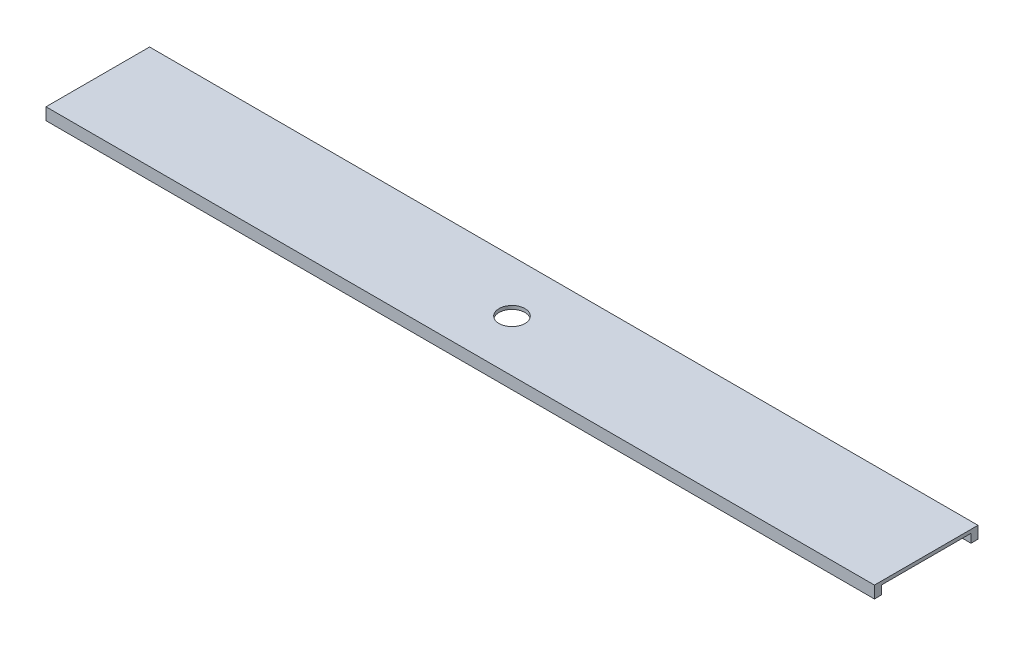
ISO-10303-21;
HEADER;
FILE_DESCRIPTION(('STEP AP214'),'2;1');
FILE_NAME('part.step','',(''),(''),'','','');
FILE_SCHEMA(('AUTOMOTIVE_DESIGN { 1 0 10303 214 1 1 1 1 }'));
ENDSEC;
DATA;
#1=APPLICATION_CONTEXT('core data for automotive mechanical design processes');
#2=APPLICATION_PROTOCOL_DEFINITION('international standard','automotive_design',2000,#1);
#3=PRODUCT_CONTEXT('',#1,'mechanical');
#4=PRODUCT('Part','Part','',(#3));
#5=PRODUCT_RELATED_PRODUCT_CATEGORY('part','',(#4));
#6=PRODUCT_DEFINITION_FORMATION('','',#4);
#7=PRODUCT_DEFINITION_CONTEXT('part definition',#1,'design');
#8=PRODUCT_DEFINITION('design','',#6,#7);
#9=PRODUCT_DEFINITION_SHAPE('','',#8);
#10=(LENGTH_UNIT() NAMED_UNIT(*) SI_UNIT(.MILLI.,.METRE.));
#11=(NAMED_UNIT(*) PLANE_ANGLE_UNIT() SI_UNIT($,.RADIAN.));
#12=(NAMED_UNIT(*) SI_UNIT($,.STERADIAN.) SOLID_ANGLE_UNIT());
#13=UNCERTAINTY_MEASURE_WITH_UNIT(LENGTH_MEASURE(1.E-05),#10,'distance_accuracy_value','');
#14=(GEOMETRIC_REPRESENTATION_CONTEXT(3) GLOBAL_UNCERTAINTY_ASSIGNED_CONTEXT((#13)) GLOBAL_UNIT_ASSIGNED_CONTEXT((#10,
#11,#12)) REPRESENTATION_CONTEXT('',''));
#15=CARTESIAN_POINT('',(0.,0.,0.));
#16=DIRECTION('',(0.,0.,1.));
#17=DIRECTION('',(1.,0.,0.));
#18=AXIS2_PLACEMENT_3D('',#15,#16,#17);
#19=CARTESIAN_POINT('',(0.,0.,0.));
#20=DIRECTION('',(0.,1.,0.));
#21=DIRECTION('',(0.,0.,1.));
#22=AXIS2_PLACEMENT_3D('',#19,#20,#21);
#23=PLANE('',#22);
#24=CARTESIAN_POINT('',(0.,0.,0.));
#25=DIRECTION('',(0.,1.,0.));
#26=DIRECTION('',(0.,0.,1.));
#27=AXIS2_PLACEMENT_3D('',#24,#25,#26);
#28=CIRCLE('',#27,15.);
#29=CARTESIAN_POINT('',(0.,0.,15.));
#30=VERTEX_POINT('',#29);
#31=EDGE_CURVE('E159',#30,#30,#28,.F.);
#32=ORIENTED_EDGE('',*,*,#31,.F.);
#33=EDGE_LOOP('',(#32));
#34=FACE_BOUND('',#33,.T.);
#35=DIRECTION('',(-1.,0.,0.));
#36=VECTOR('',#35,1.);
#37=CARTESIAN_POINT('',(-480.,0.,-51.8862795922261));
#38=LINE('',#37,#36);
#39=CARTESIAN_POINT('',(480.,0.,-51.8862795922261));
#40=VERTEX_POINT('',#39);
#41=CARTESIAN_POINT('',(-480.,0.,-51.8862795922261));
#42=VERTEX_POINT('',#41);
#43=EDGE_CURVE('E120',#40,#42,#38,.T.);
#44=ORIENTED_EDGE('',*,*,#43,.F.);
#45=DIRECTION('',(0.,0.,-1.));
#46=VECTOR('',#45,1.);
#47=CARTESIAN_POINT('',(480.,0.,-60.));
#48=LINE('',#47,#46);
#49=CARTESIAN_POINT('',(480.,0.,51.6509983036163));
#50=VERTEX_POINT('',#49);
#51=EDGE_CURVE('E150',#50,#40,#48,.T.);
#52=ORIENTED_EDGE('',*,*,#51,.F.);
#53=DIRECTION('',(1.,0.,0.));
#54=VECTOR('',#53,1.);
#55=CARTESIAN_POINT('',(-480.,0.,51.6509983036163));
#56=LINE('',#55,#54);
#57=CARTESIAN_POINT('',(-480.,0.,51.6509983036163));
#58=VERTEX_POINT('',#57);
#59=EDGE_CURVE('E129',#58,#50,#56,.T.);
#60=ORIENTED_EDGE('',*,*,#59,.F.);
#61=DIRECTION('',(0.,0.,1.));
#62=VECTOR('',#61,1.);
#63=CARTESIAN_POINT('',(-480.,0.,-60.));
#64=LINE('',#63,#62);
#65=EDGE_CURVE('E38',#42,#58,#64,.T.);
#66=ORIENTED_EDGE('',*,*,#65,.F.);
#67=EDGE_LOOP('',(#44,#52,#60,#66));
#68=FACE_BOUND('',#67,.T.);
#69=ADVANCED_FACE('F34',(#34,#68),#23,.F.);
#70=CARTESIAN_POINT('',(0.,4.,0.));
#71=DIRECTION('',(0.,1.,0.));
#72=DIRECTION('',(0.,0.,1.));
#73=AXIS2_PLACEMENT_3D('',#70,#71,#72);
#74=PLANE('',#73);
#75=DIRECTION('',(0.,0.,-1.));
#76=VECTOR('',#75,1.);
#77=CARTESIAN_POINT('',(480.,4.,-60.));
#78=LINE('',#77,#76);
#79=CARTESIAN_POINT('',(480.,4.,60.));
#80=VERTEX_POINT('',#79);
#81=CARTESIAN_POINT('',(480.,4.,-60.));
#82=VERTEX_POINT('',#81);
#83=EDGE_CURVE('E176',#80,#82,#78,.T.);
#84=ORIENTED_EDGE('',*,*,#83,.T.);
#85=DIRECTION('',(-1.,0.,0.));
#86=VECTOR('',#85,1.);
#87=CARTESIAN_POINT('',(-480.,4.,-60.));
#88=LINE('',#87,#86);
#89=CARTESIAN_POINT('',(-480.,4.,-60.));
#90=VERTEX_POINT('',#89);
#91=EDGE_CURVE('E175',#82,#90,#88,.T.);
#92=ORIENTED_EDGE('',*,*,#91,.T.);
#93=DIRECTION('',(0.,0.,1.));
#94=VECTOR('',#93,1.);
#95=CARTESIAN_POINT('',(-480.,4.,-60.));
#96=LINE('',#95,#94);
#97=CARTESIAN_POINT('',(-480.,4.,60.));
#98=VERTEX_POINT('',#97);
#99=EDGE_CURVE('E105',#90,#98,#96,.T.);
#100=ORIENTED_EDGE('',*,*,#99,.T.);
#101=DIRECTION('',(1.,0.,0.));
#102=VECTOR('',#101,1.);
#103=CARTESIAN_POINT('',(-480.,4.,60.));
#104=LINE('',#103,#102);
#105=EDGE_CURVE('E169',#98,#80,#104,.T.);
#106=ORIENTED_EDGE('',*,*,#105,.T.);
#107=EDGE_LOOP('',(#84,#92,#100,#106));
#108=FACE_BOUND('',#107,.T.);
#109=CARTESIAN_POINT('',(0.,4.,0.));
#110=DIRECTION('',(0.,1.,0.));
#111=DIRECTION('',(0.,0.,1.));
#112=AXIS2_PLACEMENT_3D('',#109,#110,#111);
#113=CIRCLE('',#112,15.);
#114=CARTESIAN_POINT('',(0.,4.,15.));
#115=VERTEX_POINT('',#114);
#116=EDGE_CURVE('E144',#115,#115,#113,.F.);
#117=ORIENTED_EDGE('',*,*,#116,.T.);
#118=EDGE_LOOP('',(#117));
#119=FACE_BOUND('',#118,.T.);
#120=ADVANCED_FACE('F196',(#108,#119),#74,.T.);
#121=CARTESIAN_POINT('',(480.,4.,-60.));
#122=DIRECTION('',(-1.,0.,0.));
#123=DIRECTION('',(0.,0.,1.));
#124=AXIS2_PLACEMENT_3D('',#121,#122,#123);
#125=PLANE('',#124);
#126=DIRECTION('',(0.,-1.,0.));
#127=VECTOR('',#126,1.);
#128=CARTESIAN_POINT('',(480.,4.,60.));
#129=LINE('',#128,#127);
#130=CARTESIAN_POINT('',(480.,-10.,60.));
#131=VERTEX_POINT('',#130);
#132=EDGE_CURVE('E168',#80,#131,#129,.T.);
#133=ORIENTED_EDGE('',*,*,#132,.T.);
#134=DIRECTION('',(0.,0.,1.));
#135=VECTOR('',#134,1.);
#136=CARTESIAN_POINT('',(480.,-10.,60.));
#137=LINE('',#136,#135);
#138=CARTESIAN_POINT('',(480.,-10.,51.6509983036163));
#139=VERTEX_POINT('',#138);
#140=EDGE_CURVE('E135',#139,#131,#137,.T.);
#141=ORIENTED_EDGE('',*,*,#140,.F.);
#142=DIRECTION('',(0.,1.,0.));
#143=VECTOR('',#142,1.);
#144=CARTESIAN_POINT('',(480.,-10.,51.6509983036163));
#145=LINE('',#144,#143);
#146=EDGE_CURVE('E141',#139,#50,#145,.T.);
#147=ORIENTED_EDGE('',*,*,#146,.T.);
#148=ORIENTED_EDGE('',*,*,#51,.T.);
#149=DIRECTION('',(0.,1.,0.));
#150=VECTOR('',#149,1.);
#151=CARTESIAN_POINT('',(480.,-10.,-51.8862795922261));
#152=LINE('',#151,#150);
#153=CARTESIAN_POINT('',(480.,-10.,-51.8862795922261));
#154=VERTEX_POINT('',#153);
#155=EDGE_CURVE('E127',#154,#40,#152,.T.);
#156=ORIENTED_EDGE('',*,*,#155,.F.);
#157=DIRECTION('',(0.,0.,1.));
#158=VECTOR('',#157,1.);
#159=CARTESIAN_POINT('',(480.,-10.,-60.));
#160=LINE('',#159,#158);
#161=CARTESIAN_POINT('',(480.,-10.,-60.));
#162=VERTEX_POINT('',#161);
#163=EDGE_CURVE('E115',#162,#154,#160,.T.);
#164=ORIENTED_EDGE('',*,*,#163,.F.);
#165=DIRECTION('',(0.,-1.,0.));
#166=VECTOR('',#165,1.);
#167=CARTESIAN_POINT('',(480.,4.,-60.));
#168=LINE('',#167,#166);
#169=EDGE_CURVE('E11',#82,#162,#168,.T.);
#170=ORIENTED_EDGE('',*,*,#169,.F.);
#171=ORIENTED_EDGE('',*,*,#83,.F.);
#172=EDGE_LOOP('',(#133,#141,#147,#148,#156,#164,#170,#171));
#173=FACE_BOUND('',#172,.T.);
#174=ADVANCED_FACE('F36',(#173),#125,.F.);
#175=CARTESIAN_POINT('',(-480.,4.,-60.));
#176=DIRECTION('',(0.,0.,1.));
#177=DIRECTION('',(1.,0.,0.));
#178=AXIS2_PLACEMENT_3D('',#175,#176,#177);
#179=PLANE('',#178);
#180=ORIENTED_EDGE('',*,*,#169,.T.);
#181=DIRECTION('',(1.,0.,0.));
#182=VECTOR('',#181,1.);
#183=CARTESIAN_POINT('',(-480.,-10.,-60.));
#184=LINE('',#183,#182);
#185=CARTESIAN_POINT('',(-480.,-10.,-60.));
#186=VERTEX_POINT('',#185);
#187=EDGE_CURVE('E110',#186,#162,#184,.T.);
#188=ORIENTED_EDGE('',*,*,#187,.F.);
#189=DIRECTION('',(0.,-1.,0.));
#190=VECTOR('',#189,1.);
#191=CARTESIAN_POINT('',(-480.,4.,-60.));
#192=LINE('',#191,#190);
#193=EDGE_CURVE('E44',#90,#186,#192,.T.);
#194=ORIENTED_EDGE('',*,*,#193,.F.);
#195=ORIENTED_EDGE('',*,*,#91,.F.);
#196=EDGE_LOOP('',(#180,#188,#194,#195));
#197=FACE_BOUND('',#196,.T.);
#198=ADVANCED_FACE('F111',(#197),#179,.F.);
#199=CARTESIAN_POINT('',(-480.,4.,-60.));
#200=DIRECTION('',(1.,0.,0.));
#201=DIRECTION('',(0.,0.,-1.));
#202=AXIS2_PLACEMENT_3D('',#199,#200,#201);
#203=PLANE('',#202);
#204=ORIENTED_EDGE('',*,*,#193,.T.);
#205=DIRECTION('',(0.,0.,-1.));
#206=VECTOR('',#205,1.);
#207=CARTESIAN_POINT('',(-480.,-10.,-60.));
#208=LINE('',#207,#206);
#209=CARTESIAN_POINT('',(-480.,-10.,-51.8862795922261));
#210=VERTEX_POINT('',#209);
#211=EDGE_CURVE('E103',#210,#186,#208,.T.);
#212=ORIENTED_EDGE('',*,*,#211,.F.);
#213=DIRECTION('',(0.,1.,0.));
#214=VECTOR('',#213,1.);
#215=CARTESIAN_POINT('',(-480.,-10.,-51.8862795922261));
#216=LINE('',#215,#214);
#217=EDGE_CURVE('E52',#210,#42,#216,.T.);
#218=ORIENTED_EDGE('',*,*,#217,.T.);
#219=ORIENTED_EDGE('',*,*,#65,.T.);
#220=DIRECTION('',(0.,1.,0.));
#221=VECTOR('',#220,1.);
#222=CARTESIAN_POINT('',(-480.,-10.,51.6509983036163));
#223=LINE('',#222,#221);
#224=CARTESIAN_POINT('',(-480.,-10.,51.6509983036163));
#225=VERTEX_POINT('',#224);
#226=EDGE_CURVE('E155',#225,#58,#223,.T.);
#227=ORIENTED_EDGE('',*,*,#226,.F.);
#228=DIRECTION('',(0.,0.,-1.));
#229=VECTOR('',#228,1.);
#230=CARTESIAN_POINT('',(-480.,-10.,60.));
#231=LINE('',#230,#229);
#232=CARTESIAN_POINT('',(-480.,-10.,60.));
#233=VERTEX_POINT('',#232);
#234=EDGE_CURVE('E130',#233,#225,#231,.T.);
#235=ORIENTED_EDGE('',*,*,#234,.F.);
#236=DIRECTION('',(0.,-1.,0.));
#237=VECTOR('',#236,1.);
#238=CARTESIAN_POINT('',(-480.,4.,60.));
#239=LINE('',#238,#237);
#240=EDGE_CURVE('E107',#98,#233,#239,.T.);
#241=ORIENTED_EDGE('',*,*,#240,.F.);
#242=ORIENTED_EDGE('',*,*,#99,.F.);
#243=EDGE_LOOP('',(#204,#212,#218,#219,#227,#235,#241,#242));
#244=FACE_BOUND('',#243,.T.);
#245=ADVANCED_FACE('F101',(#244),#203,.F.);
#246=CARTESIAN_POINT('',(-480.,4.,60.));
#247=DIRECTION('',(0.,0.,-1.));
#248=DIRECTION('',(-1.,0.,0.));
#249=AXIS2_PLACEMENT_3D('',#246,#247,#248);
#250=PLANE('',#249);
#251=ORIENTED_EDGE('',*,*,#240,.T.);
#252=DIRECTION('',(-1.,0.,0.));
#253=VECTOR('',#252,1.);
#254=CARTESIAN_POINT('',(-480.,-10.,60.));
#255=LINE('',#254,#253);
#256=EDGE_CURVE('E138',#131,#233,#255,.T.);
#257=ORIENTED_EDGE('',*,*,#256,.F.);
#258=ORIENTED_EDGE('',*,*,#132,.F.);
#259=ORIENTED_EDGE('',*,*,#105,.F.);
#260=EDGE_LOOP('',(#251,#257,#258,#259));
#261=FACE_BOUND('',#260,.T.);
#262=ADVANCED_FACE('F194',(#261),#250,.F.);
#263=CARTESIAN_POINT('',(0.,28.,0.));
#264=DIRECTION('',(0.,-1.,0.));
#265=DIRECTION('',(0.,0.,-1.));
#266=AXIS2_PLACEMENT_3D('',#263,#264,#265);
#267=CYLINDRICAL_SURFACE('',#266,15.);
#268=ORIENTED_EDGE('',*,*,#116,.F.);
#269=EDGE_LOOP('',(#268));
#270=FACE_BOUND('',#269,.T.);
#271=ORIENTED_EDGE('',*,*,#31,.T.);
#272=EDGE_LOOP('',(#271));
#273=FACE_BOUND('',#272,.T.);
#274=ADVANCED_FACE('F202',(#270,#273),#267,.F.);
#275=CARTESIAN_POINT('',(-480.,-10.,51.6509983036163));
#276=DIRECTION('',(0.,0.,1.));
#277=DIRECTION('',(1.,0.,0.));
#278=AXIS2_PLACEMENT_3D('',#275,#276,#277);
#279=PLANE('',#278);
#280=ORIENTED_EDGE('',*,*,#59,.T.);
#281=ORIENTED_EDGE('',*,*,#146,.F.);
#282=DIRECTION('',(1.,0.,0.));
#283=VECTOR('',#282,1.);
#284=CARTESIAN_POINT('',(-480.,-10.,51.6509983036163));
#285=LINE('',#284,#283);
#286=EDGE_CURVE('E133',#225,#139,#285,.T.);
#287=ORIENTED_EDGE('',*,*,#286,.F.);
#288=ORIENTED_EDGE('',*,*,#226,.T.);
#289=EDGE_LOOP('',(#280,#281,#287,#288));
#290=FACE_BOUND('',#289,.T.);
#291=ADVANCED_FACE('F187',(#290),#279,.F.);
#292=CARTESIAN_POINT('',(0.,-10.,0.));
#293=DIRECTION('',(0.,-1.,0.));
#294=DIRECTION('',(0.,0.,-1.));
#295=AXIS2_PLACEMENT_3D('',#292,#293,#294);
#296=PLANE('',#295);
#297=ORIENTED_EDGE('',*,*,#234,.T.);
#298=ORIENTED_EDGE('',*,*,#286,.T.);
#299=ORIENTED_EDGE('',*,*,#140,.T.);
#300=ORIENTED_EDGE('',*,*,#256,.T.);
#301=EDGE_LOOP('',(#297,#298,#299,#300));
#302=FACE_BOUND('',#301,.T.);
#303=ADVANCED_FACE('F191',(#302),#296,.T.);
#304=CARTESIAN_POINT('',(-480.,-10.,-51.8862795922261));
#305=DIRECTION('',(0.,0.,-1.));
#306=DIRECTION('',(-1.,0.,0.));
#307=AXIS2_PLACEMENT_3D('',#304,#305,#306);
#308=PLANE('',#307);
#309=ORIENTED_EDGE('',*,*,#43,.T.);
#310=ORIENTED_EDGE('',*,*,#217,.F.);
#311=DIRECTION('',(-1.,0.,0.));
#312=VECTOR('',#311,1.);
#313=CARTESIAN_POINT('',(-480.,-10.,-51.8862795922261));
#314=LINE('',#313,#312);
#315=EDGE_CURVE('E119',#154,#210,#314,.T.);
#316=ORIENTED_EDGE('',*,*,#315,.F.);
#317=ORIENTED_EDGE('',*,*,#155,.T.);
#318=EDGE_LOOP('',(#309,#310,#316,#317));
#319=FACE_BOUND('',#318,.T.);
#320=ADVANCED_FACE('F242',(#319),#308,.F.);
#321=CARTESIAN_POINT('',(0.,-10.,0.));
#322=DIRECTION('',(0.,1.,0.));
#323=DIRECTION('',(0.,0.,1.));
#324=AXIS2_PLACEMENT_3D('',#321,#322,#323);
#325=PLANE('',#324);
#326=ORIENTED_EDGE('',*,*,#211,.T.);
#327=ORIENTED_EDGE('',*,*,#187,.T.);
#328=ORIENTED_EDGE('',*,*,#163,.T.);
#329=ORIENTED_EDGE('',*,*,#315,.T.);
#330=EDGE_LOOP('',(#326,#327,#328,#329));
#331=FACE_BOUND('',#330,.T.);
#332=ADVANCED_FACE('F117',(#331),#325,.F.);
#333=CLOSED_SHELL('',(#69,#120,#174,#198,#245,#262,#274,#291,#303,#320,#332));
#334=MANIFOLD_SOLID_BREP('B2',#333);
#335=ADVANCED_BREP_SHAPE_REPRESENTATION('',(#18,#334),#14);
#336=SHAPE_DEFINITION_REPRESENTATION(#9,#335);
ENDSEC;
END-ISO-10303-21;
